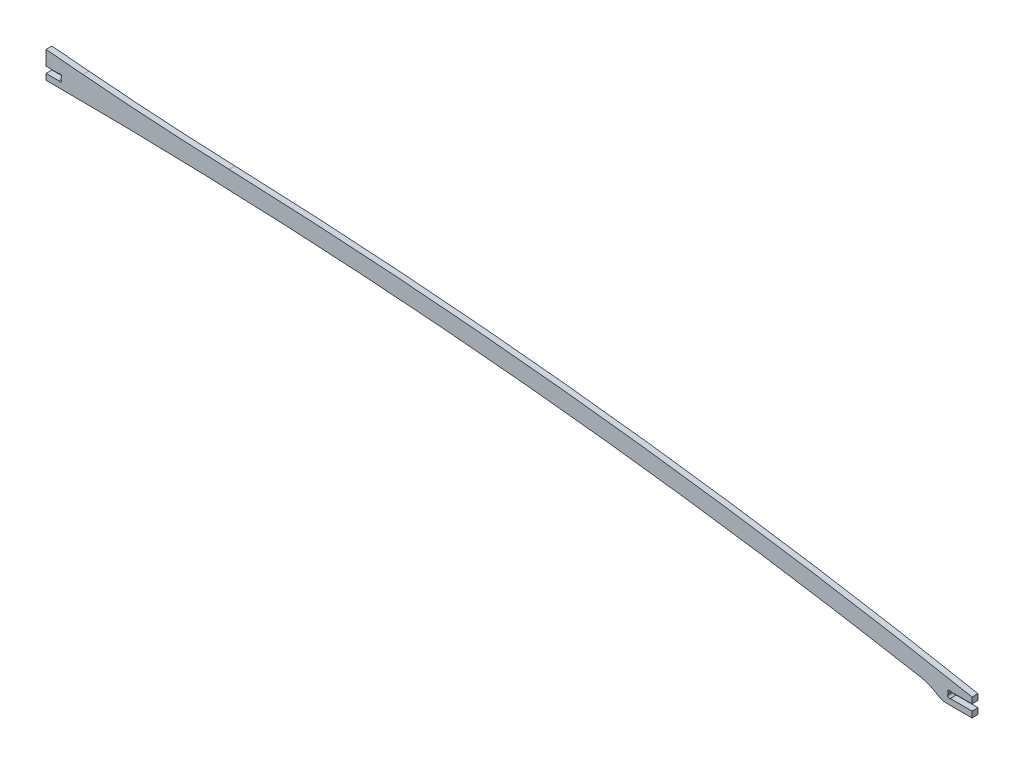
ISO-10303-21;
HEADER;
FILE_DESCRIPTION(('STEP AP214'),'2;1');
FILE_NAME('part.step','',(''),(''),'','','');
FILE_SCHEMA(('AUTOMOTIVE_DESIGN { 1 0 10303 214 1 1 1 1 }'));
ENDSEC;
DATA;
#1=APPLICATION_CONTEXT('core data for automotive mechanical design processes');
#2=APPLICATION_PROTOCOL_DEFINITION('international standard','automotive_design',2000,#1);
#3=PRODUCT_CONTEXT('',#1,'mechanical');
#4=PRODUCT('Part','Part','',(#3));
#5=PRODUCT_RELATED_PRODUCT_CATEGORY('part','',(#4));
#6=PRODUCT_DEFINITION_FORMATION('','',#4);
#7=PRODUCT_DEFINITION_CONTEXT('part definition',#1,'design');
#8=PRODUCT_DEFINITION('design','',#6,#7);
#9=PRODUCT_DEFINITION_SHAPE('','',#8);
#10=(LENGTH_UNIT() NAMED_UNIT(*) SI_UNIT(.MILLI.,.METRE.));
#11=(NAMED_UNIT(*) PLANE_ANGLE_UNIT() SI_UNIT($,.RADIAN.));
#12=(NAMED_UNIT(*) SI_UNIT($,.STERADIAN.) SOLID_ANGLE_UNIT());
#13=UNCERTAINTY_MEASURE_WITH_UNIT(LENGTH_MEASURE(1.E-05),#10,'distance_accuracy_value','');
#14=(GEOMETRIC_REPRESENTATION_CONTEXT(3) GLOBAL_UNCERTAINTY_ASSIGNED_CONTEXT((#13)) GLOBAL_UNIT_ASSIGNED_CONTEXT((#10,
#11,#12)) REPRESENTATION_CONTEXT('',''));
#15=CARTESIAN_POINT('',(0.,0.,0.));
#16=DIRECTION('',(0.,0.,1.));
#17=DIRECTION('',(1.,0.,0.));
#18=AXIS2_PLACEMENT_3D('',#15,#16,#17);
#19=CARTESIAN_POINT('',(0.,0.,1.));
#20=DIRECTION('',(1.,0.,0.));
#21=DIRECTION('',(0.,0.,-1.));
#22=AXIS2_PLACEMENT_3D('',#19,#20,#21);
#23=PLANE('',#22);
#24=DIRECTION('',(0.,-1.,0.));
#25=VECTOR('',#24,1.);
#26=CARTESIAN_POINT('',(0.,0.,-1.));
#27=LINE('',#26,#25);
#28=CARTESIAN_POINT('',(0.,1645.60416666667,-1.));
#29=VERTEX_POINT('',#28);
#30=CARTESIAN_POINT('',(0.,1640.70416666667,-1.));
#31=VERTEX_POINT('',#30);
#32=EDGE_CURVE('E243',#29,#31,#27,.T.);
#33=ORIENTED_EDGE('',*,*,#32,.T.);
#34=DIRECTION('',(0.,0.,1.));
#35=VECTOR('',#34,1.);
#36=CARTESIAN_POINT('',(0.,1640.70416666667,-1.));
#37=LINE('',#36,#35);
#38=CARTESIAN_POINT('',(0.,1640.70416666667,1.));
#39=VERTEX_POINT('',#38);
#40=EDGE_CURVE('E255',#31,#39,#37,.T.);
#41=ORIENTED_EDGE('',*,*,#40,.T.);
#42=DIRECTION('',(0.,-1.,0.));
#43=VECTOR('',#42,1.);
#44=CARTESIAN_POINT('',(0.,0.,1.));
#45=LINE('',#44,#43);
#46=CARTESIAN_POINT('',(0.,1645.60416666667,1.));
#47=VERTEX_POINT('',#46);
#48=EDGE_CURVE('E279',#47,#39,#45,.T.);
#49=ORIENTED_EDGE('',*,*,#48,.F.);
#50=DIRECTION('',(0.,0.,1.));
#51=VECTOR('',#50,1.);
#52=CARTESIAN_POINT('',(0.,1645.60416666667,-41.1517109536154));
#53=LINE('',#52,#51);
#54=EDGE_CURVE('E264',#29,#47,#53,.T.);
#55=ORIENTED_EDGE('',*,*,#54,.F.);
#56=EDGE_LOOP('',(#33,#41,#49,#55));
#57=FACE_BOUND('',#56,.T.);
#58=ADVANCED_FACE('F42',(#57),#23,.F.);
#59=CARTESIAN_POINT('',(0.,0.,1.));
#60=DIRECTION('',(0.,0.,-1.));
#61=DIRECTION('',(-1.,0.,0.));
#62=AXIS2_PLACEMENT_3D('',#59,#60,#61);
#63=CYLINDRICAL_SURFACE('',#62,1642.60416666667);
#64=CARTESIAN_POINT('',(0.,0.,-1.));
#65=DIRECTION('',(0.,0.,1.));
#66=DIRECTION('',(1.,0.,0.));
#67=AXIS2_PLACEMENT_3D('',#64,#65,#66);
#68=CIRCLE('',#67,1642.60416666667);
#69=CARTESIAN_POINT('',(312.5,1612.60416666667,-1.));
#70=VERTEX_POINT('',#69);
#71=CARTESIAN_POINT('',(61.7532086430288,1641.44295958555,-1.));
#72=VERTEX_POINT('',#71);
#73=EDGE_CURVE('E271',#70,#72,#68,.T.);
#74=ORIENTED_EDGE('',*,*,#73,.T.);
#75=DIRECTION('',(0.,0.,-1.));
#76=VECTOR('',#75,1.);
#77=CARTESIAN_POINT('',(61.7532086430288,1641.44295958555,1.));
#78=LINE('',#77,#76);
#79=CARTESIAN_POINT('',(61.7532086430288,1641.44295958555,1.));
#80=VERTEX_POINT('',#79);
#81=EDGE_CURVE('E284',#72,#80,#78,.F.);
#82=ORIENTED_EDGE('',*,*,#81,.T.);
#83=CARTESIAN_POINT('',(0.,0.,1.));
#84=DIRECTION('',(0.,0.,1.));
#85=DIRECTION('',(1.,0.,0.));
#86=AXIS2_PLACEMENT_3D('',#83,#84,#85);
#87=CIRCLE('',#86,1642.60416666667);
#88=CARTESIAN_POINT('',(312.5,1612.60416666667,1.));
#89=VERTEX_POINT('',#88);
#90=EDGE_CURVE('E403',#89,#80,#87,.T.);
#91=ORIENTED_EDGE('',*,*,#90,.F.);
#92=DIRECTION('',(0.,0.,-1.));
#93=VECTOR('',#92,1.);
#94=CARTESIAN_POINT('',(312.5,1612.60416666667,1.));
#95=LINE('',#94,#93);
#96=EDGE_CURVE('E278',#89,#70,#95,.T.);
#97=ORIENTED_EDGE('',*,*,#96,.T.);
#98=EDGE_LOOP('',(#74,#82,#91,#97));
#99=FACE_BOUND('',#98,.T.);
#100=ADVANCED_FACE('F462',(#99),#63,.T.);
#101=CARTESIAN_POINT('',(312.5,0.,1.));
#102=DIRECTION('',(1.,0.,0.));
#103=DIRECTION('',(0.,0.,-1.));
#104=AXIS2_PLACEMENT_3D('',#101,#102,#103);
#105=PLANE('',#104);
#106=DIRECTION('',(0.,-1.,0.));
#107=VECTOR('',#106,1.);
#108=CARTESIAN_POINT('',(312.5,0.,1.));
#109=LINE('',#108,#107);
#110=CARTESIAN_POINT('',(312.5,1610.59814593661,1.));
#111=VERTEX_POINT('',#110);
#112=EDGE_CURVE('E400',#89,#111,#109,.T.);
#113=ORIENTED_EDGE('',*,*,#112,.T.);
#114=DIRECTION('',(0.,0.,1.));
#115=VECTOR('',#114,1.);
#116=CARTESIAN_POINT('',(312.5,1610.59814593661,-1.));
#117=LINE('',#116,#115);
#118=CARTESIAN_POINT('',(312.5,1610.59814593661,-1.));
#119=VERTEX_POINT('',#118);
#120=EDGE_CURVE('E389',#119,#111,#117,.T.);
#121=ORIENTED_EDGE('',*,*,#120,.F.);
#122=DIRECTION('',(0.,-1.,0.));
#123=VECTOR('',#122,1.);
#124=CARTESIAN_POINT('',(312.5,0.,-1.));
#125=LINE('',#124,#123);
#126=EDGE_CURVE('E410',#70,#119,#125,.T.);
#127=ORIENTED_EDGE('',*,*,#126,.F.);
#128=ORIENTED_EDGE('',*,*,#96,.F.);
#129=EDGE_LOOP('',(#113,#121,#127,#128));
#130=FACE_BOUND('',#129,.T.);
#131=ADVANCED_FACE('F465',(#130),#105,.T.);
#132=CARTESIAN_POINT('',(312.5,1608.49814593661,-1.));
#133=VERTEX_POINT('',#132);
#134=CARTESIAN_POINT('',(312.5,1606.49212520656,-1.));
#135=VERTEX_POINT('',#134);
#136=EDGE_CURVE('E409',#133,#135,#125,.T.);
#137=ORIENTED_EDGE('',*,*,#136,.F.);
#138=DIRECTION('',(0.,0.,1.));
#139=VECTOR('',#138,1.);
#140=CARTESIAN_POINT('',(312.5,1608.49814593661,-1.));
#141=LINE('',#140,#139);
#142=CARTESIAN_POINT('',(312.5,1608.49814593661,1.));
#143=VERTEX_POINT('',#142);
#144=EDGE_CURVE('E393',#133,#143,#141,.T.);
#145=ORIENTED_EDGE('',*,*,#144,.T.);
#146=CARTESIAN_POINT('',(312.5,1606.49212520656,1.));
#147=VERTEX_POINT('',#146);
#148=EDGE_CURVE('E268',#143,#147,#109,.T.);
#149=ORIENTED_EDGE('',*,*,#148,.T.);
#150=DIRECTION('',(0.,0.,-1.));
#151=VECTOR('',#150,1.);
#152=CARTESIAN_POINT('',(312.5,1606.49212520656,1.));
#153=LINE('',#152,#151);
#154=EDGE_CURVE('E281',#147,#135,#153,.T.);
#155=ORIENTED_EDGE('',*,*,#154,.T.);
#156=EDGE_LOOP('',(#137,#145,#149,#155));
#157=FACE_BOUND('',#156,.T.);
#158=ADVANCED_FACE('F424',(#157),#105,.T.);
#159=CARTESIAN_POINT('',(0.,0.,1.));
#160=DIRECTION('',(0.,0.,1.));
#161=DIRECTION('',(1.,0.,0.));
#162=AXIS2_PLACEMENT_3D('',#159,#160,#161);
#163=PLANE('',#162);
#164=DIRECTION('',(-0.866025403784489,0.499999999999913,0.));
#165=VECTOR('',#164,1.);
#166=CARTESIAN_POINT('',(771.256495704159,1335.85543622744,1.));
#167=LINE('',#166,#165);
#168=CARTESIAN_POINT('',(301.339745962156,1607.16199818764,1.));
#169=VERTEX_POINT('',#168);
#170=CARTESIAN_POINT('',(299.845739758204,1608.02456307166,1.));
#171=VERTEX_POINT('',#170);
#172=EDGE_CURVE('E380',#169,#171,#167,.T.);
#173=ORIENTED_EDGE('',*,*,#172,.F.);
#174=CARTESIAN_POINT('',(303.839745962155,1611.49212520656,1.));
#175=DIRECTION('',(0.,0.,1.));
#176=DIRECTION('',(1.,0.,0.));
#177=AXIS2_PLACEMENT_3D('',#174,#175,#176);
#178=CIRCLE('',#177,5.);
#179=CARTESIAN_POINT('',(303.839745962155,1606.49212520656,1.));
#180=VERTEX_POINT('',#179);
#181=EDGE_CURVE('E64',#169,#180,#178,.T.);
#182=ORIENTED_EDGE('',*,*,#181,.T.);
#183=DIRECTION('',(-1.,0.,0.));
#184=VECTOR('',#183,1.);
#185=CARTESIAN_POINT('',(0.,1606.49212520656,1.));
#186=LINE('',#185,#184);
#187=EDGE_CURVE('E388',#147,#180,#186,.T.);
#188=ORIENTED_EDGE('',*,*,#187,.F.);
#189=ORIENTED_EDGE('',*,*,#148,.F.);
#190=DIRECTION('',(-1.,0.,0.));
#191=VECTOR('',#190,1.);
#192=CARTESIAN_POINT('',(0.,1608.49814593661,1.));
#193=LINE('',#192,#191);
#194=CARTESIAN_POINT('',(305.214929555609,1608.49814593661,1.));
#195=VERTEX_POINT('',#194);
#196=EDGE_CURVE('E428',#143,#195,#193,.T.);
#197=ORIENTED_EDGE('',*,*,#196,.T.);
#198=CARTESIAN_POINT('',(305.214929555609,1608.19814593661,1.));
#199=DIRECTION('',(0.,0.,1.));
#200=DIRECTION('',(1.,0.,0.));
#201=AXIS2_PLACEMENT_3D('',#198,#199,#200);
#202=CIRCLE('',#201,0.3);
#203=CARTESIAN_POINT('',(305.041913493728,1608.44322845809,1.));
#204=VERTEX_POINT('',#203);
#205=EDGE_CURVE('E310',#195,#204,#202,.T.);
#206=ORIENTED_EDGE('',*,*,#205,.T.);
#207=CARTESIAN_POINT('',(304.753553390593,1608.85169932721,1.));
#208=DIRECTION('',(0.,0.,1.));
#209=DIRECTION('',(1.,0.,0.));
#210=AXIS2_PLACEMENT_3D('',#207,#208,#209);
#211=CIRCLE('',#210,0.500000000000035);
#212=CARTESIAN_POINT('',(304.345082521472,1609.14005943034,1.));
#213=VERTEX_POINT('',#212);
#214=EDGE_CURVE('E483',#213,#204,#211,.T.);
#215=ORIENTED_EDGE('',*,*,#214,.F.);
#216=CARTESIAN_POINT('',(304.1,1609.31307549222,1.));
#217=DIRECTION('',(0.,0.,1.));
#218=DIRECTION('',(1.,0.,0.));
#219=AXIS2_PLACEMENT_3D('',#216,#217,#218);
#220=CIRCLE('',#219,0.3);
#221=CARTESIAN_POINT('',(304.4,1609.31307549222,1.));
#222=VERTEX_POINT('',#221);
#223=EDGE_CURVE('E308',#213,#222,#220,.T.);
#224=ORIENTED_EDGE('',*,*,#223,.T.);
#225=DIRECTION('',(0.,1.,0.));
#226=VECTOR('',#225,1.);
#227=CARTESIAN_POINT('',(304.4,0.,1.));
#228=LINE('',#227,#226);
#229=CARTESIAN_POINT('',(304.4,1609.783216381,1.));
#230=VERTEX_POINT('',#229);
#231=EDGE_CURVE('E433',#222,#230,#228,.T.);
#232=ORIENTED_EDGE('',*,*,#231,.T.);
#233=CARTESIAN_POINT('',(304.1,1609.783216381,1.));
#234=DIRECTION('',(0.,0.,1.));
#235=DIRECTION('',(1.,0.,0.));
#236=AXIS2_PLACEMENT_3D('',#233,#234,#235);
#237=CIRCLE('',#236,0.3);
#238=CARTESIAN_POINT('',(304.345082521472,1609.95623244288,1.));
#239=VERTEX_POINT('',#238);
#240=EDGE_CURVE('E312',#230,#239,#237,.T.);
#241=ORIENTED_EDGE('',*,*,#240,.T.);
#242=CARTESIAN_POINT('',(304.753553390593,1610.24459254602,1.));
#243=DIRECTION('',(0.,0.,1.));
#244=DIRECTION('',(1.,0.,0.));
#245=AXIS2_PLACEMENT_3D('',#242,#243,#244);
#246=CIRCLE('',#245,0.500000000000153);
#247=CARTESIAN_POINT('',(305.041913493728,1610.65306341514,1.));
#248=VERTEX_POINT('',#247);
#249=EDGE_CURVE('E480',#248,#239,#246,.T.);
#250=ORIENTED_EDGE('',*,*,#249,.F.);
#251=CARTESIAN_POINT('',(305.214929555609,1610.89814593661,1.));
#252=DIRECTION('',(0.,0.,1.));
#253=DIRECTION('',(1.,0.,0.));
#254=AXIS2_PLACEMENT_3D('',#251,#252,#253);
#255=CIRCLE('',#254,0.3);
#256=CARTESIAN_POINT('',(305.214929555609,1610.59814593661,1.));
#257=VERTEX_POINT('',#256);
#258=EDGE_CURVE('E306',#248,#257,#255,.T.);
#259=ORIENTED_EDGE('',*,*,#258,.T.);
#260=DIRECTION('',(1.,0.,0.));
#261=VECTOR('',#260,1.);
#262=CARTESIAN_POINT('',(0.,1610.59814593661,1.));
#263=LINE('',#262,#261);
#264=EDGE_CURVE('E438',#257,#111,#263,.T.);
#265=ORIENTED_EDGE('',*,*,#264,.T.);
#266=ORIENTED_EDGE('',*,*,#112,.F.);
#267=ORIENTED_EDGE('',*,*,#90,.T.);
#268=CARTESIAN_POINT('',(99.34790729057,2640.73602902695,1.));
#269=DIRECTION('',(0.,0.,1.));
#270=DIRECTION('',(1.,0.,0.));
#271=AXIS2_PLACEMENT_3D('',#268,#269,#270);
#272=CIRCLE('',#271,1000.);
#273=CARTESIAN_POINT('',(12.499709331838,1644.51447208727,1.));
#274=VERTEX_POINT('',#273);
#275=EDGE_CURVE('E289',#80,#274,#272,.F.);
#276=ORIENTED_EDGE('',*,*,#275,.T.);
#277=DIRECTION('',(0.996221556939681,-0.086848197958732,0.));
#278=VECTOR('',#277,1.);
#279=CARTESIAN_POINT('',(142.377749823408,1633.19201706456,1.));
#280=LINE('',#279,#278);
#281=EDGE_CURVE('E261',#47,#274,#280,.T.);
#282=ORIENTED_EDGE('',*,*,#281,.F.);
#283=ORIENTED_EDGE('',*,*,#48,.T.);
#284=DIRECTION('',(-1.,0.,0.));
#285=VECTOR('',#284,1.);
#286=CARTESIAN_POINT('',(5.1,1640.70416666667,1.));
#287=LINE('',#286,#285);
#288=CARTESIAN_POINT('',(4.2850704443915,1640.70416666667,1.));
#289=VERTEX_POINT('',#288);
#290=EDGE_CURVE('E258',#289,#39,#287,.T.);
#291=ORIENTED_EDGE('',*,*,#290,.F.);
#292=CARTESIAN_POINT('',(4.2850704443915,1641.00416666667,1.));
#293=DIRECTION('',(0.,0.,1.));
#294=DIRECTION('',(1.,0.,0.));
#295=AXIS2_PLACEMENT_3D('',#292,#293,#294);
#296=CIRCLE('',#295,0.3);
#297=CARTESIAN_POINT('',(4.45808650627226,1640.75908414519,1.));
#298=VERTEX_POINT('',#297);
#299=EDGE_CURVE('E298',#289,#298,#296,.T.);
#300=ORIENTED_EDGE('',*,*,#299,.T.);
#301=CARTESIAN_POINT('',(4.74644660940667,1640.35061327607,1.));
#302=DIRECTION('',(0.,0.,1.));
#303=DIRECTION('',(1.,0.,0.));
#304=AXIS2_PLACEMENT_3D('',#301,#302,#303);
#305=CIRCLE('',#304,0.499999999999937);
#306=CARTESIAN_POINT('',(5.1549174785275,1640.06225317294,1.));
#307=VERTEX_POINT('',#306);
#308=EDGE_CURVE('E484',#307,#298,#305,.T.);
#309=ORIENTED_EDGE('',*,*,#308,.F.);
#310=CARTESIAN_POINT('',(5.4,1639.88923711106,1.));
#311=DIRECTION('',(0.,0.,1.));
#312=DIRECTION('',(1.,0.,0.));
#313=AXIS2_PLACEMENT_3D('',#310,#311,#312);
#314=CIRCLE('',#313,0.3);
#315=CARTESIAN_POINT('',(5.1,1639.88923711106,1.));
#316=VERTEX_POINT('',#315);
#317=EDGE_CURVE('E300',#307,#316,#314,.T.);
#318=ORIENTED_EDGE('',*,*,#317,.T.);
#319=DIRECTION('',(0.,1.,0.));
#320=VECTOR('',#319,1.);
#321=CARTESIAN_POINT('',(5.1,1638.60416666667,1.));
#322=LINE('',#321,#320);
#323=CARTESIAN_POINT('',(5.1,1639.41909622227,1.));
#324=VERTEX_POINT('',#323);
#325=EDGE_CURVE('E509',#324,#316,#322,.T.);
#326=ORIENTED_EDGE('',*,*,#325,.F.);
#327=CARTESIAN_POINT('',(5.4,1639.41909622227,1.));
#328=DIRECTION('',(0.,0.,1.));
#329=DIRECTION('',(1.,0.,0.));
#330=AXIS2_PLACEMENT_3D('',#327,#328,#329);
#331=CIRCLE('',#330,0.3);
#332=CARTESIAN_POINT('',(5.15491747852752,1639.24608016039,1.));
#333=VERTEX_POINT('',#332);
#334=EDGE_CURVE('E302',#324,#333,#331,.T.);
#335=ORIENTED_EDGE('',*,*,#334,.T.);
#336=CARTESIAN_POINT('',(4.74644660940671,1638.95772005726,1.));
#337=DIRECTION('',(0.,0.,1.));
#338=DIRECTION('',(1.,0.,0.));
#339=AXIS2_PLACEMENT_3D('',#336,#337,#338);
#340=CIRCLE('',#339,0.50000000000004);
#341=CARTESIAN_POINT('',(4.45808650627214,1638.54924918814,1.));
#342=VERTEX_POINT('',#341);
#343=EDGE_CURVE('E489',#342,#333,#340,.T.);
#344=ORIENTED_EDGE('',*,*,#343,.F.);
#345=CARTESIAN_POINT('',(4.28507044439136,1638.30416666667,1.));
#346=DIRECTION('',(0.,0.,1.));
#347=DIRECTION('',(1.,0.,0.));
#348=AXIS2_PLACEMENT_3D('',#345,#346,#347);
#349=CIRCLE('',#348,0.3);
#350=CARTESIAN_POINT('',(4.28507044439136,1638.60416666667,1.));
#351=VERTEX_POINT('',#350);
#352=EDGE_CURVE('E304',#342,#351,#349,.T.);
#353=ORIENTED_EDGE('',*,*,#352,.T.);
#354=DIRECTION('',(1.,0.,0.));
#355=VECTOR('',#354,1.);
#356=CARTESIAN_POINT('',(0.,1638.60416666667,1.));
#357=LINE('',#356,#355);
#358=CARTESIAN_POINT('',(0.,1638.60416666667,1.));
#359=VERTEX_POINT('',#358);
#360=EDGE_CURVE('E501',#359,#351,#357,.T.);
#361=ORIENTED_EDGE('',*,*,#360,.F.);
#362=CARTESIAN_POINT('',(0.,1636.60416666667,1.));
#363=VERTEX_POINT('',#362);
#364=EDGE_CURVE('E406',#359,#363,#45,.T.);
#365=ORIENTED_EDGE('',*,*,#364,.T.);
#366=CARTESIAN_POINT('',(0.,0.,1.));
#367=DIRECTION('',(0.,0.,1.));
#368=DIRECTION('',(1.,0.,0.));
#369=AXIS2_PLACEMENT_3D('',#366,#367,#368);
#370=CIRCLE('',#369,1636.60416666667);
#371=CARTESIAN_POINT('',(295.049966958969,1609.78840701137,1.));
#372=VERTEX_POINT('',#371);
#373=EDGE_CURVE('E265',#372,#363,#370,.T.);
#374=ORIENTED_EDGE('',*,*,#373,.F.);
#375=CARTESIAN_POINT('',(292.345739758205,1595.03418201489,1.));
#376=DIRECTION('',(0.,0.,1.));
#377=DIRECTION('',(1.,0.,0.));
#378=AXIS2_PLACEMENT_3D('',#375,#376,#377);
#379=CIRCLE('',#378,15.);
#380=EDGE_CURVE('E368',#372,#171,#379,.F.);
#381=ORIENTED_EDGE('',*,*,#380,.T.);
#382=EDGE_LOOP('',(#173,#182,#188,#189,#197,#206,#215,#224,#232,#241,#250,#259,#265,#266,#267,
#276,#282,#283,#291,#300,#309,#318,#326,#335,#344,#353,#361,#365,#374,#381));
#383=FACE_BOUND('',#382,.T.);
#384=ADVANCED_FACE('F385',(#383),#163,.T.);
#385=CARTESIAN_POINT('',(0.,0.,-1.));
#386=DIRECTION('',(0.,0.,1.));
#387=DIRECTION('',(1.,0.,0.));
#388=AXIS2_PLACEMENT_3D('',#385,#386,#387);
#389=PLANE('',#388);
#390=DIRECTION('',(1.,0.,0.));
#391=VECTOR('',#390,1.);
#392=CARTESIAN_POINT('',(0.,1606.49212520656,-1.));
#393=LINE('',#392,#391);
#394=CARTESIAN_POINT('',(303.839745962155,1606.49212520656,-1.));
#395=VERTEX_POINT('',#394);
#396=EDGE_CURVE('E396',#395,#135,#393,.T.);
#397=ORIENTED_EDGE('',*,*,#396,.F.);
#398=CARTESIAN_POINT('',(303.839745962155,1611.49212520656,-1.));
#399=DIRECTION('',(0.,0.,1.));
#400=DIRECTION('',(1.,0.,0.));
#401=AXIS2_PLACEMENT_3D('',#398,#399,#400);
#402=CIRCLE('',#401,5.);
#403=CARTESIAN_POINT('',(301.339745962156,1607.16199818764,-1.));
#404=VERTEX_POINT('',#403);
#405=EDGE_CURVE('E11',#395,#404,#402,.F.);
#406=ORIENTED_EDGE('',*,*,#405,.T.);
#407=DIRECTION('',(0.866025403784489,-0.499999999999913,0.));
#408=VECTOR('',#407,1.);
#409=CARTESIAN_POINT('',(771.256495704159,1335.85543622744,-1.));
#410=LINE('',#409,#408);
#411=CARTESIAN_POINT('',(299.845739758203,1608.02456307166,-1.));
#412=VERTEX_POINT('',#411);
#413=EDGE_CURVE('E382',#412,#404,#410,.T.);
#414=ORIENTED_EDGE('',*,*,#413,.F.);
#415=CARTESIAN_POINT('',(292.345739758205,1595.03418201489,-1.));
#416=DIRECTION('',(0.,0.,1.));
#417=DIRECTION('',(1.,0.,0.));
#418=AXIS2_PLACEMENT_3D('',#415,#416,#417);
#419=CIRCLE('',#418,15.);
#420=CARTESIAN_POINT('',(295.049966958969,1609.78840701137,-1.));
#421=VERTEX_POINT('',#420);
#422=EDGE_CURVE('E371',#412,#421,#419,.T.);
#423=ORIENTED_EDGE('',*,*,#422,.T.);
#424=CARTESIAN_POINT('',(0.,0.,-1.));
#425=DIRECTION('',(0.,0.,1.));
#426=DIRECTION('',(1.,0.,0.));
#427=AXIS2_PLACEMENT_3D('',#424,#425,#426);
#428=CIRCLE('',#427,1636.60416666667);
#429=CARTESIAN_POINT('',(0.,1636.60416666667,-1.));
#430=VERTEX_POINT('',#429);
#431=EDGE_CURVE('E408',#421,#430,#428,.T.);
#432=ORIENTED_EDGE('',*,*,#431,.T.);
#433=CARTESIAN_POINT('',(0.,1638.60416666667,-1.));
#434=VERTEX_POINT('',#433);
#435=EDGE_CURVE('E266',#434,#430,#27,.T.);
#436=ORIENTED_EDGE('',*,*,#435,.F.);
#437=DIRECTION('',(1.,0.,0.));
#438=VECTOR('',#437,1.);
#439=CARTESIAN_POINT('',(0.,1638.60416666667,-1.));
#440=LINE('',#439,#438);
#441=CARTESIAN_POINT('',(4.28507044439136,1638.60416666667,-1.));
#442=VERTEX_POINT('',#441);
#443=EDGE_CURVE('E502',#434,#442,#440,.T.);
#444=ORIENTED_EDGE('',*,*,#443,.T.);
#445=CARTESIAN_POINT('',(4.28507044439136,1638.30416666667,-1.));
#446=DIRECTION('',(0.,0.,1.));
#447=DIRECTION('',(1.,0.,0.));
#448=AXIS2_PLACEMENT_3D('',#445,#446,#447);
#449=CIRCLE('',#448,0.3);
#450=CARTESIAN_POINT('',(4.45808650627214,1638.54924918814,-1.));
#451=VERTEX_POINT('',#450);
#452=EDGE_CURVE('E324',#442,#451,#449,.F.);
#453=ORIENTED_EDGE('',*,*,#452,.T.);
#454=CARTESIAN_POINT('',(4.74644660940671,1638.95772005726,-1.));
#455=DIRECTION('',(0.,0.,1.));
#456=DIRECTION('',(1.,0.,0.));
#457=AXIS2_PLACEMENT_3D('',#454,#455,#456);
#458=CIRCLE('',#457,0.50000000000004);
#459=CARTESIAN_POINT('',(5.15491747852752,1639.24608016039,-1.));
#460=VERTEX_POINT('',#459);
#461=EDGE_CURVE('E486',#451,#460,#458,.T.);
#462=ORIENTED_EDGE('',*,*,#461,.T.);
#463=CARTESIAN_POINT('',(5.4,1639.41909622227,-1.));
#464=DIRECTION('',(0.,0.,1.));
#465=DIRECTION('',(1.,0.,0.));
#466=AXIS2_PLACEMENT_3D('',#463,#464,#465);
#467=CIRCLE('',#466,0.3);
#468=CARTESIAN_POINT('',(5.1,1639.41909622227,-1.));
#469=VERTEX_POINT('',#468);
#470=EDGE_CURVE('E322',#460,#469,#467,.F.);
#471=ORIENTED_EDGE('',*,*,#470,.T.);
#472=DIRECTION('',(0.,1.,0.));
#473=VECTOR('',#472,1.);
#474=CARTESIAN_POINT('',(5.1,1638.60416666667,-1.));
#475=LINE('',#474,#473);
#476=CARTESIAN_POINT('',(5.1,1639.88923711106,-1.));
#477=VERTEX_POINT('',#476);
#478=EDGE_CURVE('E252',#469,#477,#475,.T.);
#479=ORIENTED_EDGE('',*,*,#478,.T.);
#480=CARTESIAN_POINT('',(5.4,1639.88923711106,-1.));
#481=DIRECTION('',(0.,0.,1.));
#482=DIRECTION('',(1.,0.,0.));
#483=AXIS2_PLACEMENT_3D('',#480,#481,#482);
#484=CIRCLE('',#483,0.3);
#485=CARTESIAN_POINT('',(5.1549174785275,1640.06225317294,-1.));
#486=VERTEX_POINT('',#485);
#487=EDGE_CURVE('E320',#477,#486,#484,.F.);
#488=ORIENTED_EDGE('',*,*,#487,.T.);
#489=CARTESIAN_POINT('',(4.74644660940667,1640.35061327607,-1.));
#490=DIRECTION('',(0.,0.,1.));
#491=DIRECTION('',(1.,0.,0.));
#492=AXIS2_PLACEMENT_3D('',#489,#490,#491);
#493=CIRCLE('',#492,0.499999999999937);
#494=CARTESIAN_POINT('',(4.45808650627226,1640.75908414519,-1.));
#495=VERTEX_POINT('',#494);
#496=EDGE_CURVE('E495',#486,#495,#493,.T.);
#497=ORIENTED_EDGE('',*,*,#496,.T.);
#498=CARTESIAN_POINT('',(4.2850704443915,1641.00416666667,-1.));
#499=DIRECTION('',(0.,0.,1.));
#500=DIRECTION('',(1.,0.,0.));
#501=AXIS2_PLACEMENT_3D('',#498,#499,#500);
#502=CIRCLE('',#501,0.3);
#503=CARTESIAN_POINT('',(4.2850704443915,1640.70416666667,-1.));
#504=VERTEX_POINT('',#503);
#505=EDGE_CURVE('E247',#495,#504,#502,.F.);
#506=ORIENTED_EDGE('',*,*,#505,.T.);
#507=DIRECTION('',(-1.,0.,0.));
#508=VECTOR('',#507,1.);
#509=CARTESIAN_POINT('',(5.1,1640.70416666667,-1.));
#510=LINE('',#509,#508);
#511=EDGE_CURVE('E238',#504,#31,#510,.T.);
#512=ORIENTED_EDGE('',*,*,#511,.T.);
#513=ORIENTED_EDGE('',*,*,#32,.F.);
#514=DIRECTION('',(-0.99622155693968,0.086848197958732,0.));
#515=VECTOR('',#514,1.);
#516=CARTESIAN_POINT('',(142.377749823408,1633.19201706456,-1.));
#517=LINE('',#516,#515);
#518=CARTESIAN_POINT('',(12.499709331838,1644.51447208727,-1.));
#519=VERTEX_POINT('',#518);
#520=EDGE_CURVE('E445',#519,#29,#517,.T.);
#521=ORIENTED_EDGE('',*,*,#520,.F.);
#522=CARTESIAN_POINT('',(99.34790729057,2640.73602902695,-1.));
#523=DIRECTION('',(0.,0.,1.));
#524=DIRECTION('',(1.,0.,0.));
#525=AXIS2_PLACEMENT_3D('',#522,#523,#524);
#526=CIRCLE('',#525,1000.);
#527=EDGE_CURVE('E291',#519,#72,#526,.T.);
#528=ORIENTED_EDGE('',*,*,#527,.T.);
#529=ORIENTED_EDGE('',*,*,#73,.F.);
#530=ORIENTED_EDGE('',*,*,#126,.T.);
#531=DIRECTION('',(1.,0.,0.));
#532=VECTOR('',#531,1.);
#533=CARTESIAN_POINT('',(0.,1610.59814593661,-1.));
#534=LINE('',#533,#532);
#535=CARTESIAN_POINT('',(305.214929555609,1610.59814593661,-1.));
#536=VERTEX_POINT('',#535);
#537=EDGE_CURVE('E432',#536,#119,#534,.T.);
#538=ORIENTED_EDGE('',*,*,#537,.F.);
#539=CARTESIAN_POINT('',(305.214929555609,1610.89814593661,-1.));
#540=DIRECTION('',(0.,0.,1.));
#541=DIRECTION('',(1.,0.,0.));
#542=AXIS2_PLACEMENT_3D('',#539,#540,#541);
#543=CIRCLE('',#542,0.3);
#544=CARTESIAN_POINT('',(305.041913493728,1610.65306341514,-1.));
#545=VERTEX_POINT('',#544);
#546=EDGE_CURVE('E326',#536,#545,#543,.F.);
#547=ORIENTED_EDGE('',*,*,#546,.T.);
#548=CARTESIAN_POINT('',(304.753553390593,1610.24459254602,-1.));
#549=DIRECTION('',(0.,0.,1.));
#550=DIRECTION('',(1.,0.,0.));
#551=AXIS2_PLACEMENT_3D('',#548,#549,#550);
#552=CIRCLE('',#551,0.500000000000153);
#553=CARTESIAN_POINT('',(304.345082521472,1609.95623244288,-1.));
#554=VERTEX_POINT('',#553);
#555=EDGE_CURVE('E482',#545,#554,#552,.T.);
#556=ORIENTED_EDGE('',*,*,#555,.T.);
#557=CARTESIAN_POINT('',(304.1,1609.783216381,-1.));
#558=DIRECTION('',(0.,0.,1.));
#559=DIRECTION('',(1.,0.,0.));
#560=AXIS2_PLACEMENT_3D('',#557,#558,#559);
#561=CIRCLE('',#560,0.3);
#562=CARTESIAN_POINT('',(304.4,1609.783216381,-1.));
#563=VERTEX_POINT('',#562);
#564=EDGE_CURVE('E332',#554,#563,#561,.F.);
#565=ORIENTED_EDGE('',*,*,#564,.T.);
#566=DIRECTION('',(0.,1.,0.));
#567=VECTOR('',#566,1.);
#568=CARTESIAN_POINT('',(304.4,0.,-1.));
#569=LINE('',#568,#567);
#570=CARTESIAN_POINT('',(304.4,1609.31307549222,-1.));
#571=VERTEX_POINT('',#570);
#572=EDGE_CURVE('E435',#571,#563,#569,.T.);
#573=ORIENTED_EDGE('',*,*,#572,.F.);
#574=CARTESIAN_POINT('',(304.1,1609.31307549222,-1.));
#575=DIRECTION('',(0.,0.,1.));
#576=DIRECTION('',(1.,0.,0.));
#577=AXIS2_PLACEMENT_3D('',#574,#575,#576);
#578=CIRCLE('',#577,0.3);
#579=CARTESIAN_POINT('',(304.345082521472,1609.14005943034,-1.));
#580=VERTEX_POINT('',#579);
#581=EDGE_CURVE('E328',#571,#580,#578,.F.);
#582=ORIENTED_EDGE('',*,*,#581,.T.);
#583=CARTESIAN_POINT('',(304.753553390593,1608.85169932721,-1.));
#584=DIRECTION('',(0.,0.,1.));
#585=DIRECTION('',(1.,0.,0.));
#586=AXIS2_PLACEMENT_3D('',#583,#584,#585);
#587=CIRCLE('',#586,0.500000000000035);
#588=CARTESIAN_POINT('',(305.041913493728,1608.44322845809,-1.));
#589=VERTEX_POINT('',#588);
#590=EDGE_CURVE('E497',#580,#589,#587,.T.);
#591=ORIENTED_EDGE('',*,*,#590,.T.);
#592=CARTESIAN_POINT('',(305.214929555609,1608.19814593661,-1.));
#593=DIRECTION('',(0.,0.,1.));
#594=DIRECTION('',(1.,0.,0.));
#595=AXIS2_PLACEMENT_3D('',#592,#593,#594);
#596=CIRCLE('',#595,0.3);
#597=CARTESIAN_POINT('',(305.214929555609,1608.49814593661,-1.));
#598=VERTEX_POINT('',#597);
#599=EDGE_CURVE('E330',#589,#598,#596,.F.);
#600=ORIENTED_EDGE('',*,*,#599,.T.);
#601=DIRECTION('',(-1.,0.,0.));
#602=VECTOR('',#601,1.);
#603=CARTESIAN_POINT('',(0.,1608.49814593661,-1.));
#604=LINE('',#603,#602);
#605=EDGE_CURVE('E420',#133,#598,#604,.T.);
#606=ORIENTED_EDGE('',*,*,#605,.F.);
#607=ORIENTED_EDGE('',*,*,#136,.T.);
#608=EDGE_LOOP('',(#397,#406,#414,#423,#432,#436,#444,#453,#462,#471,#479,#488,#497,#506,#512,
#513,#521,#528,#529,#530,#538,#547,#556,#565,#573,#582,#591,#600,#606,#607));
#609=FACE_BOUND('',#608,.T.);
#610=ADVANCED_FACE('F240',(#609),#389,.F.);
#611=CARTESIAN_POINT('',(0.,0.,1.));
#612=DIRECTION('',(0.,0.,-1.));
#613=DIRECTION('',(-1.,0.,0.));
#614=AXIS2_PLACEMENT_3D('',#611,#612,#613);
#615=CYLINDRICAL_SURFACE('',#614,1636.60416666667);
#616=ORIENTED_EDGE('',*,*,#431,.F.);
#617=DIRECTION('',(0.,0.,-1.));
#618=VECTOR('',#617,1.);
#619=CARTESIAN_POINT('',(295.049966958969,1609.78840701137,1.));
#620=LINE('',#619,#618);
#621=EDGE_CURVE('E363',#421,#372,#620,.F.);
#622=ORIENTED_EDGE('',*,*,#621,.T.);
#623=ORIENTED_EDGE('',*,*,#373,.T.);
#624=DIRECTION('',(0.,0.,-1.));
#625=VECTOR('',#624,1.);
#626=CARTESIAN_POINT('',(0.,1636.60416666667,1.));
#627=LINE('',#626,#625);
#628=EDGE_CURVE('E275',#363,#430,#627,.T.);
#629=ORIENTED_EDGE('',*,*,#628,.T.);
#630=EDGE_LOOP('',(#616,#622,#623,#629));
#631=FACE_BOUND('',#630,.T.);
#632=ADVANCED_FACE('F548',(#631),#615,.F.);
#633=ORIENTED_EDGE('',*,*,#364,.F.);
#634=DIRECTION('',(0.,0.,1.));
#635=VECTOR('',#634,1.);
#636=CARTESIAN_POINT('',(0.,1638.60416666667,-1.));
#637=LINE('',#636,#635);
#638=EDGE_CURVE('E251',#434,#359,#637,.T.);
#639=ORIENTED_EDGE('',*,*,#638,.F.);
#640=ORIENTED_EDGE('',*,*,#435,.T.);
#641=ORIENTED_EDGE('',*,*,#628,.F.);
#642=EDGE_LOOP('',(#633,#639,#640,#641));
#643=FACE_BOUND('',#642,.T.);
#644=ADVANCED_FACE('F541',(#643),#23,.F.);
#645=CARTESIAN_POINT('',(771.256495704159,1335.85543622744,-16.4499827963918));
#646=DIRECTION('',(0.499999999999913,0.866025403784489,0.));
#647=DIRECTION('',(-0.866025403784489,0.499999999999913,0.));
#648=AXIS2_PLACEMENT_3D('',#645,#646,#647);
#649=PLANE('',#648);
#650=ORIENTED_EDGE('',*,*,#413,.T.);
#651=DIRECTION('',(0.,0.,1.));
#652=VECTOR('',#651,1.);
#653=CARTESIAN_POINT('',(301.339745962156,1607.16199818764,-16.4499827963918));
#654=LINE('',#653,#652);
#655=EDGE_CURVE('E373',#404,#169,#654,.T.);
#656=ORIENTED_EDGE('',*,*,#655,.T.);
#657=ORIENTED_EDGE('',*,*,#172,.T.);
#658=DIRECTION('',(0.,0.,-1.));
#659=VECTOR('',#658,1.);
#660=CARTESIAN_POINT('',(299.845739758204,1608.02456307166,-16.4499827963918));
#661=LINE('',#660,#659);
#662=EDGE_CURVE('E366',#171,#412,#661,.T.);
#663=ORIENTED_EDGE('',*,*,#662,.T.);
#664=EDGE_LOOP('',(#650,#656,#657,#663));
#665=FACE_BOUND('',#664,.T.);
#666=ADVANCED_FACE('F379',(#665),#649,.F.);
#667=CARTESIAN_POINT('',(0.,1606.49212520656,-16.4499827963918));
#668=DIRECTION('',(0.,1.,0.));
#669=DIRECTION('',(0.,0.,1.));
#670=AXIS2_PLACEMENT_3D('',#667,#668,#669);
#671=PLANE('',#670);
#672=ORIENTED_EDGE('',*,*,#187,.T.);
#673=DIRECTION('',(0.,0.,1.));
#674=VECTOR('',#673,1.);
#675=CARTESIAN_POINT('',(303.839745962155,1606.49212520656,-16.4499827963918));
#676=LINE('',#675,#674);
#677=EDGE_CURVE('E50',#180,#395,#676,.F.);
#678=ORIENTED_EDGE('',*,*,#677,.T.);
#679=ORIENTED_EDGE('',*,*,#396,.T.);
#680=ORIENTED_EDGE('',*,*,#154,.F.);
#681=EDGE_LOOP('',(#672,#678,#679,#680));
#682=FACE_BOUND('',#681,.T.);
#683=ADVANCED_FACE('F426',(#682),#671,.F.);
#684=CARTESIAN_POINT('',(0.,1610.59814593661,-1.));
#685=DIRECTION('',(0.,-1.,0.));
#686=DIRECTION('',(0.,0.,-1.));
#687=AXIS2_PLACEMENT_3D('',#684,#685,#686);
#688=PLANE('',#687);
#689=ORIENTED_EDGE('',*,*,#264,.F.);
#690=DIRECTION('',(0.,0.,-1.));
#691=VECTOR('',#690,1.);
#692=CARTESIAN_POINT('',(305.214929555609,1610.59814593661,-1.));
#693=LINE('',#692,#691);
#694=EDGE_CURVE('E342',#257,#536,#693,.T.);
#695=ORIENTED_EDGE('',*,*,#694,.T.);
#696=ORIENTED_EDGE('',*,*,#537,.T.);
#697=ORIENTED_EDGE('',*,*,#120,.T.);
#698=EDGE_LOOP('',(#689,#695,#696,#697));
#699=FACE_BOUND('',#698,.T.);
#700=ADVANCED_FACE('F468',(#699),#688,.T.);
#701=CARTESIAN_POINT('',(0.,1608.49814593661,-1.));
#702=DIRECTION('',(0.,1.,0.));
#703=DIRECTION('',(0.,0.,1.));
#704=AXIS2_PLACEMENT_3D('',#701,#702,#703);
#705=PLANE('',#704);
#706=ORIENTED_EDGE('',*,*,#605,.T.);
#707=DIRECTION('',(0.,0.,-1.));
#708=VECTOR('',#707,1.);
#709=CARTESIAN_POINT('',(305.214929555609,1608.49814593661,1.));
#710=LINE('',#709,#708);
#711=EDGE_CURVE('E334',#598,#195,#710,.F.);
#712=ORIENTED_EDGE('',*,*,#711,.T.);
#713=ORIENTED_EDGE('',*,*,#196,.F.);
#714=ORIENTED_EDGE('',*,*,#144,.F.);
#715=EDGE_LOOP('',(#706,#712,#713,#714));
#716=FACE_BOUND('',#715,.T.);
#717=ADVANCED_FACE('F617',(#716),#705,.T.);
#718=CARTESIAN_POINT('',(304.4,0.,-1.));
#719=DIRECTION('',(1.,0.,0.));
#720=DIRECTION('',(0.,0.,-1.));
#721=AXIS2_PLACEMENT_3D('',#718,#719,#720);
#722=PLANE('',#721);
#723=ORIENTED_EDGE('',*,*,#572,.T.);
#724=DIRECTION('',(0.,0.,-1.));
#725=VECTOR('',#724,1.);
#726=CARTESIAN_POINT('',(304.4,1609.783216381,1.));
#727=LINE('',#726,#725);
#728=EDGE_CURVE('E295',#563,#230,#727,.F.);
#729=ORIENTED_EDGE('',*,*,#728,.T.);
#730=ORIENTED_EDGE('',*,*,#231,.F.);
#731=DIRECTION('',(0.,0.,-1.));
#732=VECTOR('',#731,1.);
#733=CARTESIAN_POINT('',(304.4,1609.31307549222,-1.));
#734=LINE('',#733,#732);
#735=EDGE_CURVE('E293',#222,#571,#734,.T.);
#736=ORIENTED_EDGE('',*,*,#735,.T.);
#737=EDGE_LOOP('',(#723,#729,#730,#736));
#738=FACE_BOUND('',#737,.T.);
#739=ADVANCED_FACE('F618',(#738),#722,.T.);
#740=CARTESIAN_POINT('',(142.377749823408,1633.19201706456,-41.1517109536154));
#741=DIRECTION('',(-0.086848197958732,-0.99622155693968,0.));
#742=DIRECTION('',(0.99622155693968,-0.086848197958732,0.));
#743=AXIS2_PLACEMENT_3D('',#740,#741,#742);
#744=PLANE('',#743);
#745=ORIENTED_EDGE('',*,*,#281,.T.);
#746=DIRECTION('',(0.,0.,1.));
#747=VECTOR('',#746,1.);
#748=CARTESIAN_POINT('',(12.499709331838,1644.51447208727,-1.));
#749=LINE('',#748,#747);
#750=EDGE_CURVE('E287',#274,#519,#749,.F.);
#751=ORIENTED_EDGE('',*,*,#750,.T.);
#752=ORIENTED_EDGE('',*,*,#520,.T.);
#753=ORIENTED_EDGE('',*,*,#54,.T.);
#754=EDGE_LOOP('',(#745,#751,#752,#753));
#755=FACE_BOUND('',#754,.T.);
#756=ADVANCED_FACE('F456',(#755),#744,.F.);
#757=CARTESIAN_POINT('',(99.34790729057,2640.73602902695,1.));
#758=DIRECTION('',(0.,0.,-1.));
#759=DIRECTION('',(-1.,0.,0.));
#760=AXIS2_PLACEMENT_3D('',#757,#758,#759);
#761=CYLINDRICAL_SURFACE('',#760,1000.);
#762=ORIENTED_EDGE('',*,*,#527,.F.);
#763=ORIENTED_EDGE('',*,*,#750,.F.);
#764=ORIENTED_EDGE('',*,*,#275,.F.);
#765=ORIENTED_EDGE('',*,*,#81,.F.);
#766=EDGE_LOOP('',(#762,#763,#764,#765));
#767=FACE_BOUND('',#766,.T.);
#768=ADVANCED_FACE('F459',(#767),#761,.F.);
#769=CARTESIAN_POINT('',(5.1,1640.70416666667,-1.));
#770=DIRECTION('',(0.,1.,0.));
#771=DIRECTION('',(0.,0.,1.));
#772=AXIS2_PLACEMENT_3D('',#769,#770,#771);
#773=PLANE('',#772);
#774=ORIENTED_EDGE('',*,*,#511,.F.);
#775=DIRECTION('',(0.,0.,1.));
#776=VECTOR('',#775,1.);
#777=CARTESIAN_POINT('',(4.2850704443915,1640.70416666667,-1.));
#778=LINE('',#777,#776);
#779=EDGE_CURVE('E361',#504,#289,#778,.T.);
#780=ORIENTED_EDGE('',*,*,#779,.T.);
#781=ORIENTED_EDGE('',*,*,#290,.T.);
#782=ORIENTED_EDGE('',*,*,#40,.F.);
#783=EDGE_LOOP('',(#774,#780,#781,#782));
#784=FACE_BOUND('',#783,.T.);
#785=ADVANCED_FACE('F256',(#784),#773,.F.);
#786=CARTESIAN_POINT('',(5.1,1638.60416666667,-1.));
#787=DIRECTION('',(1.,0.,0.));
#788=DIRECTION('',(0.,0.,-1.));
#789=AXIS2_PLACEMENT_3D('',#786,#787,#788);
#790=PLANE('',#789);
#791=ORIENTED_EDGE('',*,*,#478,.F.);
#792=DIRECTION('',(0.,0.,1.));
#793=VECTOR('',#792,1.);
#794=CARTESIAN_POINT('',(5.1,1639.41909622227,-1.));
#795=LINE('',#794,#793);
#796=EDGE_CURVE('E354',#469,#324,#795,.T.);
#797=ORIENTED_EDGE('',*,*,#796,.T.);
#798=ORIENTED_EDGE('',*,*,#325,.T.);
#799=DIRECTION('',(0.,0.,1.));
#800=VECTOR('',#799,1.);
#801=CARTESIAN_POINT('',(5.1,1639.88923711106,-1.));
#802=LINE('',#801,#800);
#803=EDGE_CURVE('E351',#316,#477,#802,.F.);
#804=ORIENTED_EDGE('',*,*,#803,.T.);
#805=EDGE_LOOP('',(#791,#797,#798,#804));
#806=FACE_BOUND('',#805,.T.);
#807=ADVANCED_FACE('F516',(#806),#790,.F.);
#808=CARTESIAN_POINT('',(0.,1638.60416666667,-1.));
#809=DIRECTION('',(0.,-1.,0.));
#810=DIRECTION('',(0.,0.,-1.));
#811=AXIS2_PLACEMENT_3D('',#808,#809,#810);
#812=PLANE('',#811);
#813=ORIENTED_EDGE('',*,*,#360,.T.);
#814=DIRECTION('',(0.,0.,1.));
#815=VECTOR('',#814,1.);
#816=CARTESIAN_POINT('',(4.28507044439136,1638.60416666667,-1.));
#817=LINE('',#816,#815);
#818=EDGE_CURVE('E344',#351,#442,#817,.F.);
#819=ORIENTED_EDGE('',*,*,#818,.T.);
#820=ORIENTED_EDGE('',*,*,#443,.F.);
#821=ORIENTED_EDGE('',*,*,#638,.T.);
#822=EDGE_LOOP('',(#813,#819,#820,#821));
#823=FACE_BOUND('',#822,.T.);
#824=ADVANCED_FACE('F567',(#823),#812,.F.);
#825=CARTESIAN_POINT('',(4.74644660940671,1638.95772005726,-9.));
#826=DIRECTION('',(0.,0.,1.));
#827=DIRECTION('',(1.,0.,0.));
#828=AXIS2_PLACEMENT_3D('',#825,#826,#827);
#829=CYLINDRICAL_SURFACE('',#828,0.50000000000004);
#830=ORIENTED_EDGE('',*,*,#461,.F.);
#831=DIRECTION('',(0.,0.,1.));
#832=VECTOR('',#831,1.);
#833=CARTESIAN_POINT('',(4.45808650627213,1638.54924918814,-9.));
#834=LINE('',#833,#832);
#835=EDGE_CURVE('E349',#451,#342,#834,.T.);
#836=ORIENTED_EDGE('',*,*,#835,.T.);
#837=ORIENTED_EDGE('',*,*,#343,.T.);
#838=DIRECTION('',(0.,0.,1.));
#839=VECTOR('',#838,1.);
#840=CARTESIAN_POINT('',(5.15491747852752,1639.24608016039,-9.));
#841=LINE('',#840,#839);
#842=EDGE_CURVE('E347',#333,#460,#841,.F.);
#843=ORIENTED_EDGE('',*,*,#842,.T.);
#844=EDGE_LOOP('',(#830,#836,#837,#843));
#845=FACE_BOUND('',#844,.T.);
#846=ADVANCED_FACE('F574',(#845),#829,.F.);
#847=CARTESIAN_POINT('',(4.74644660940667,1640.35061327607,-9.));
#848=DIRECTION('',(0.,0.,1.));
#849=DIRECTION('',(1.,0.,0.));
#850=AXIS2_PLACEMENT_3D('',#847,#848,#849);
#851=CYLINDRICAL_SURFACE('',#850,0.499999999999937);
#852=ORIENTED_EDGE('',*,*,#496,.F.);
#853=DIRECTION('',(0.,0.,1.));
#854=VECTOR('',#853,1.);
#855=CARTESIAN_POINT('',(5.15491747852749,1640.06225317294,-9.));
#856=LINE('',#855,#854);
#857=EDGE_CURVE('E359',#486,#307,#856,.T.);
#858=ORIENTED_EDGE('',*,*,#857,.T.);
#859=ORIENTED_EDGE('',*,*,#308,.T.);
#860=DIRECTION('',(0.,0.,1.));
#861=VECTOR('',#860,1.);
#862=CARTESIAN_POINT('',(4.45808650627223,1640.75908414519,-9.));
#863=LINE('',#862,#861);
#864=EDGE_CURVE('E357',#298,#495,#863,.F.);
#865=ORIENTED_EDGE('',*,*,#864,.T.);
#866=EDGE_LOOP('',(#852,#858,#859,#865));
#867=FACE_BOUND('',#866,.T.);
#868=ADVANCED_FACE('F524',(#867),#851,.F.);
#869=CARTESIAN_POINT('',(304.753553390593,1608.85169932721,-9.));
#870=DIRECTION('',(0.,0.,1.));
#871=DIRECTION('',(1.,0.,0.));
#872=AXIS2_PLACEMENT_3D('',#869,#870,#871);
#873=CYLINDRICAL_SURFACE('',#872,0.500000000000035);
#874=ORIENTED_EDGE('',*,*,#214,.T.);
#875=DIRECTION('',(0.,0.,1.));
#876=VECTOR('',#875,1.);
#877=CARTESIAN_POINT('',(305.041913493728,1608.44322845809,-9.));
#878=LINE('',#877,#876);
#879=EDGE_CURVE('E340',#204,#589,#878,.F.);
#880=ORIENTED_EDGE('',*,*,#879,.T.);
#881=ORIENTED_EDGE('',*,*,#590,.F.);
#882=DIRECTION('',(0.,0.,1.));
#883=VECTOR('',#882,1.);
#884=CARTESIAN_POINT('',(304.345082521472,1609.14005943034,-9.));
#885=LINE('',#884,#883);
#886=EDGE_CURVE('E337',#580,#213,#885,.T.);
#887=ORIENTED_EDGE('',*,*,#886,.T.);
#888=EDGE_LOOP('',(#874,#880,#881,#887));
#889=FACE_BOUND('',#888,.T.);
#890=ADVANCED_FACE('F634',(#889),#873,.F.);
#891=CARTESIAN_POINT('',(304.753553390593,1610.24459254602,-9.));
#892=DIRECTION('',(0.,0.,1.));
#893=DIRECTION('',(1.,0.,0.));
#894=AXIS2_PLACEMENT_3D('',#891,#892,#893);
#895=CYLINDRICAL_SURFACE('',#894,0.500000000000153);
#896=ORIENTED_EDGE('',*,*,#249,.T.);
#897=DIRECTION('',(0.,0.,1.));
#898=VECTOR('',#897,1.);
#899=CARTESIAN_POINT('',(304.345082521472,1609.95623244288,-9.));
#900=LINE('',#899,#898);
#901=EDGE_CURVE('E317',#239,#554,#900,.F.);
#902=ORIENTED_EDGE('',*,*,#901,.T.);
#903=ORIENTED_EDGE('',*,*,#555,.F.);
#904=DIRECTION('',(0.,0.,1.));
#905=VECTOR('',#904,1.);
#906=CARTESIAN_POINT('',(305.041913493728,1610.65306341514,-9.));
#907=LINE('',#906,#905);
#908=EDGE_CURVE('E314',#545,#248,#907,.T.);
#909=ORIENTED_EDGE('',*,*,#908,.T.);
#910=EDGE_LOOP('',(#896,#902,#903,#909));
#911=FACE_BOUND('',#910,.T.);
#912=ADVANCED_FACE('F479',(#911),#895,.F.);
#913=CARTESIAN_POINT('',(304.1,1609.783216381,-9.));
#914=DIRECTION('',(0.,0.,1.));
#915=DIRECTION('',(1.,0.,0.));
#916=AXIS2_PLACEMENT_3D('',#913,#914,#915);
#917=CYLINDRICAL_SURFACE('',#916,0.3);
#918=ORIENTED_EDGE('',*,*,#564,.F.);
#919=ORIENTED_EDGE('',*,*,#901,.F.);
#920=ORIENTED_EDGE('',*,*,#240,.F.);
#921=ORIENTED_EDGE('',*,*,#728,.F.);
#922=EDGE_LOOP('',(#918,#919,#920,#921));
#923=FACE_BOUND('',#922,.T.);
#924=ADVANCED_FACE('F594',(#923),#917,.T.);
#925=CARTESIAN_POINT('',(305.214929555609,1608.19814593661,-9.));
#926=DIRECTION('',(0.,0.,1.));
#927=DIRECTION('',(1.,0.,0.));
#928=AXIS2_PLACEMENT_3D('',#925,#926,#927);
#929=CYLINDRICAL_SURFACE('',#928,0.3);
#930=ORIENTED_EDGE('',*,*,#599,.F.);
#931=ORIENTED_EDGE('',*,*,#879,.F.);
#932=ORIENTED_EDGE('',*,*,#205,.F.);
#933=ORIENTED_EDGE('',*,*,#711,.F.);
#934=EDGE_LOOP('',(#930,#931,#932,#933));
#935=FACE_BOUND('',#934,.T.);
#936=ADVANCED_FACE('F590',(#935),#929,.T.);
#937=CARTESIAN_POINT('',(304.1,1609.31307549222,-9.));
#938=DIRECTION('',(0.,0.,1.));
#939=DIRECTION('',(1.,0.,0.));
#940=AXIS2_PLACEMENT_3D('',#937,#938,#939);
#941=CYLINDRICAL_SURFACE('',#940,0.3);
#942=ORIENTED_EDGE('',*,*,#581,.F.);
#943=ORIENTED_EDGE('',*,*,#735,.F.);
#944=ORIENTED_EDGE('',*,*,#223,.F.);
#945=ORIENTED_EDGE('',*,*,#886,.F.);
#946=EDGE_LOOP('',(#942,#943,#944,#945));
#947=FACE_BOUND('',#946,.T.);
#948=ADVANCED_FACE('F587',(#947),#941,.T.);
#949=CARTESIAN_POINT('',(305.214929555609,1610.89814593661,-9.));
#950=DIRECTION('',(0.,0.,1.));
#951=DIRECTION('',(1.,0.,0.));
#952=AXIS2_PLACEMENT_3D('',#949,#950,#951);
#953=CYLINDRICAL_SURFACE('',#952,0.3);
#954=ORIENTED_EDGE('',*,*,#546,.F.);
#955=ORIENTED_EDGE('',*,*,#694,.F.);
#956=ORIENTED_EDGE('',*,*,#258,.F.);
#957=ORIENTED_EDGE('',*,*,#908,.F.);
#958=EDGE_LOOP('',(#954,#955,#956,#957));
#959=FACE_BOUND('',#958,.T.);
#960=ADVANCED_FACE('F475',(#959),#953,.T.);
#961=CARTESIAN_POINT('',(4.28507044439136,1638.30416666667,-9.));
#962=DIRECTION('',(0.,0.,1.));
#963=DIRECTION('',(1.,0.,0.));
#964=AXIS2_PLACEMENT_3D('',#961,#962,#963);
#965=CYLINDRICAL_SURFACE('',#964,0.3);
#966=ORIENTED_EDGE('',*,*,#352,.F.);
#967=ORIENTED_EDGE('',*,*,#835,.F.);
#968=ORIENTED_EDGE('',*,*,#452,.F.);
#969=ORIENTED_EDGE('',*,*,#818,.F.);
#970=EDGE_LOOP('',(#966,#967,#968,#969));
#971=FACE_BOUND('',#970,.T.);
#972=ADVANCED_FACE('F569',(#971),#965,.T.);
#973=CARTESIAN_POINT('',(5.4,1639.41909622227,-9.));
#974=DIRECTION('',(0.,0.,1.));
#975=DIRECTION('',(1.,0.,0.));
#976=AXIS2_PLACEMENT_3D('',#973,#974,#975);
#977=CYLINDRICAL_SURFACE('',#976,0.3);
#978=ORIENTED_EDGE('',*,*,#470,.F.);
#979=ORIENTED_EDGE('',*,*,#842,.F.);
#980=ORIENTED_EDGE('',*,*,#334,.F.);
#981=ORIENTED_EDGE('',*,*,#796,.F.);
#982=EDGE_LOOP('',(#978,#979,#980,#981));
#983=FACE_BOUND('',#982,.T.);
#984=ADVANCED_FACE('F537',(#983),#977,.T.);
#985=CARTESIAN_POINT('',(5.4,1639.88923711106,-9.));
#986=DIRECTION('',(0.,0.,1.));
#987=DIRECTION('',(1.,0.,0.));
#988=AXIS2_PLACEMENT_3D('',#985,#986,#987);
#989=CYLINDRICAL_SURFACE('',#988,0.3);
#990=ORIENTED_EDGE('',*,*,#317,.F.);
#991=ORIENTED_EDGE('',*,*,#857,.F.);
#992=ORIENTED_EDGE('',*,*,#487,.F.);
#993=ORIENTED_EDGE('',*,*,#803,.F.);
#994=EDGE_LOOP('',(#990,#991,#992,#993));
#995=FACE_BOUND('',#994,.T.);
#996=ADVANCED_FACE('F520',(#995),#989,.T.);
#997=CARTESIAN_POINT('',(4.2850704443915,1641.00416666667,-9.));
#998=DIRECTION('',(0.,0.,1.));
#999=DIRECTION('',(1.,0.,0.));
#1000=AXIS2_PLACEMENT_3D('',#997,#998,#999);
#1001=CYLINDRICAL_SURFACE('',#1000,0.3);
#1002=ORIENTED_EDGE('',*,*,#505,.F.);
#1003=ORIENTED_EDGE('',*,*,#864,.F.);
#1004=ORIENTED_EDGE('',*,*,#299,.F.);
#1005=ORIENTED_EDGE('',*,*,#779,.F.);
#1006=EDGE_LOOP('',(#1002,#1003,#1004,#1005));
#1007=FACE_BOUND('',#1006,.T.);
#1008=ADVANCED_FACE('F528',(#1007),#1001,.T.);
#1009=CARTESIAN_POINT('',(292.345739758205,1595.03418201489,1.));
#1010=DIRECTION('',(0.,0.,-1.));
#1011=DIRECTION('',(-1.,0.,0.));
#1012=AXIS2_PLACEMENT_3D('',#1009,#1010,#1011);
#1013=CYLINDRICAL_SURFACE('',#1012,15.);
#1014=ORIENTED_EDGE('',*,*,#422,.F.);
#1015=ORIENTED_EDGE('',*,*,#662,.F.);
#1016=ORIENTED_EDGE('',*,*,#380,.F.);
#1017=ORIENTED_EDGE('',*,*,#621,.F.);
#1018=EDGE_LOOP('',(#1014,#1015,#1016,#1017));
#1019=FACE_BOUND('',#1018,.T.);
#1020=ADVANCED_FACE('F530',(#1019),#1013,.F.);
#1021=CARTESIAN_POINT('',(303.839745962155,1611.49212520656,-16.4499827963918));
#1022=DIRECTION('',(0.,0.,1.));
#1023=DIRECTION('',(1.,0.,0.));
#1024=AXIS2_PLACEMENT_3D('',#1021,#1022,#1023);
#1025=CYLINDRICAL_SURFACE('',#1024,5.);
#1026=ORIENTED_EDGE('',*,*,#405,.F.);
#1027=ORIENTED_EDGE('',*,*,#677,.F.);
#1028=ORIENTED_EDGE('',*,*,#181,.F.);
#1029=ORIENTED_EDGE('',*,*,#655,.F.);
#1030=EDGE_LOOP('',(#1026,#1027,#1028,#1029));
#1031=FACE_BOUND('',#1030,.T.);
#1032=ADVANCED_FACE('F44',(#1031),#1025,.T.);
#1033=CLOSED_SHELL('',(#58,#100,#131,#158,#384,#610,#632,#644,#666,#683,#700,#717,#739,#756,
#768,#785,#807,#824,#846,#868,#890,#912,#924,#936,#948,#960,#972,#984,#996,#1008,#1020,#1032));
#1034=MANIFOLD_SOLID_BREP('B2',#1033);
#1035=ADVANCED_BREP_SHAPE_REPRESENTATION('',(#18,#1034),#14);
#1036=SHAPE_DEFINITION_REPRESENTATION(#9,#1035);
ENDSEC;
END-ISO-10303-21;
